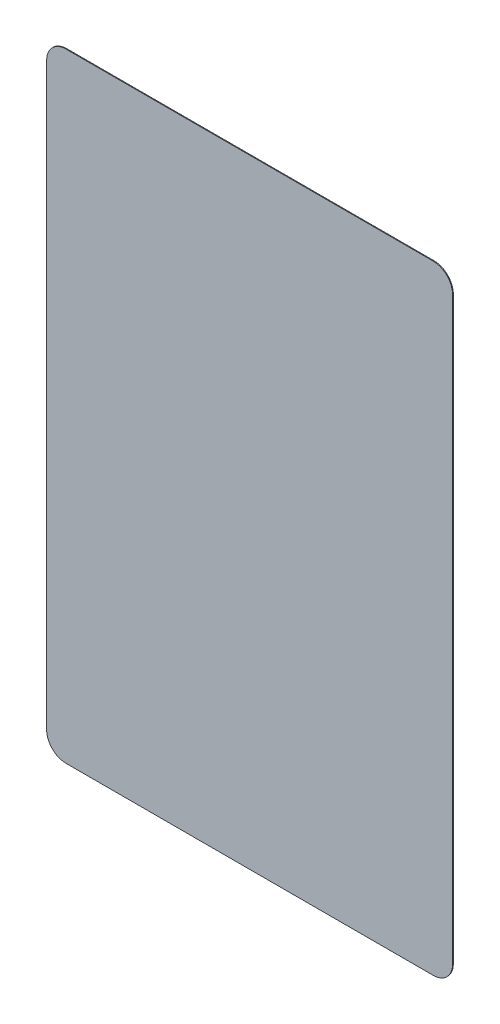
ISO-10303-21;
HEADER;
FILE_DESCRIPTION(('STEP AP214'),'2;1');
FILE_NAME('part.step','',(''),(''),'','','');
FILE_SCHEMA(('AUTOMOTIVE_DESIGN { 1 0 10303 214 1 1 1 1 }'));
ENDSEC;
DATA;
#1=APPLICATION_CONTEXT('core data for automotive mechanical design processes');
#2=APPLICATION_PROTOCOL_DEFINITION('international standard','automotive_design',2000,#1);
#3=PRODUCT_CONTEXT('',#1,'mechanical');
#4=PRODUCT('Part','Part','',(#3));
#5=PRODUCT_RELATED_PRODUCT_CATEGORY('part','',(#4));
#6=PRODUCT_DEFINITION_FORMATION('','',#4);
#7=PRODUCT_DEFINITION_CONTEXT('part definition',#1,'design');
#8=PRODUCT_DEFINITION('design','',#6,#7);
#9=PRODUCT_DEFINITION_SHAPE('','',#8);
#10=(LENGTH_UNIT() NAMED_UNIT(*) SI_UNIT(.MILLI.,.METRE.));
#11=(NAMED_UNIT(*) PLANE_ANGLE_UNIT() SI_UNIT($,.RADIAN.));
#12=(NAMED_UNIT(*) SI_UNIT($,.STERADIAN.) SOLID_ANGLE_UNIT());
#13=UNCERTAINTY_MEASURE_WITH_UNIT(LENGTH_MEASURE(1.E-05),#10,'distance_accuracy_value','');
#14=(GEOMETRIC_REPRESENTATION_CONTEXT(3) GLOBAL_UNCERTAINTY_ASSIGNED_CONTEXT((#13)) GLOBAL_UNIT_ASSIGNED_CONTEXT((#10,
#11,#12)) REPRESENTATION_CONTEXT('',''));
#15=CARTESIAN_POINT('',(0.,0.,0.));
#16=DIRECTION('',(0.,0.,1.));
#17=DIRECTION('',(1.,0.,0.));
#18=AXIS2_PLACEMENT_3D('',#15,#16,#17);
#19=CARTESIAN_POINT('',(25.,-7.5,-5.4));
#20=DIRECTION('',(0.,0.,1.));
#21=DIRECTION('',(1.,0.,0.));
#22=AXIS2_PLACEMENT_3D('',#19,#20,#21);
#23=PLANE('',#22);
#24=DIRECTION('',(-1.,0.,0.));
#25=VECTOR('',#24,1.);
#26=CARTESIAN_POINT('',(15.5,-8.,-5.4));
#27=LINE('',#26,#25);
#28=CARTESIAN_POINT('',(25.,-8.,-5.4));
#29=VERTEX_POINT('',#28);
#30=CARTESIAN_POINT('',(15.5,-8.,-5.4));
#31=VERTEX_POINT('',#30);
#32=EDGE_CURVE('E82',#29,#31,#27,.T.);
#33=ORIENTED_EDGE('',*,*,#32,.T.);
#34=CARTESIAN_POINT('',(15.5,-7.5,-5.4));
#35=DIRECTION('',(0.,0.,-1.));
#36=DIRECTION('',(-1.,0.,0.));
#37=AXIS2_PLACEMENT_3D('',#34,#35,#36);
#38=CIRCLE('',#37,0.500000000000002);
#39=CARTESIAN_POINT('',(15.,-7.5,-5.4));
#40=VERTEX_POINT('',#39);
#41=EDGE_CURVE('E105',#40,#31,#38,.F.);
#42=ORIENTED_EDGE('',*,*,#41,.F.);
#43=DIRECTION('',(0.,1.,0.));
#44=VECTOR('',#43,1.);
#45=CARTESIAN_POINT('',(15.,7.5,-5.4));
#46=LINE('',#45,#44);
#47=CARTESIAN_POINT('',(15.,7.5,-5.4));
#48=VERTEX_POINT('',#47);
#49=EDGE_CURVE('E102',#40,#48,#46,.T.);
#50=ORIENTED_EDGE('',*,*,#49,.T.);
#51=CARTESIAN_POINT('',(15.5,7.5,-5.4));
#52=DIRECTION('',(0.,0.,-1.));
#53=DIRECTION('',(-1.,0.,0.));
#54=AXIS2_PLACEMENT_3D('',#51,#52,#53);
#55=CIRCLE('',#54,0.5);
#56=CARTESIAN_POINT('',(15.5,8.,-5.4));
#57=VERTEX_POINT('',#56);
#58=EDGE_CURVE('E110',#57,#48,#55,.F.);
#59=ORIENTED_EDGE('',*,*,#58,.F.);
#60=DIRECTION('',(1.,0.,0.));
#61=VECTOR('',#60,1.);
#62=CARTESIAN_POINT('',(15.5,8.,-5.4));
#63=LINE('',#62,#61);
#64=CARTESIAN_POINT('',(25.,8.,-5.4));
#65=VERTEX_POINT('',#64);
#66=EDGE_CURVE('E107',#57,#65,#63,.T.);
#67=ORIENTED_EDGE('',*,*,#66,.T.);
#68=CARTESIAN_POINT('',(25.,7.5,-5.4));
#69=DIRECTION('',(0.,0.,-1.));
#70=DIRECTION('',(-1.,0.,0.));
#71=AXIS2_PLACEMENT_3D('',#68,#69,#70);
#72=CIRCLE('',#71,0.5);
#73=CARTESIAN_POINT('',(25.5,7.5,-5.4));
#74=VERTEX_POINT('',#73);
#75=EDGE_CURVE('E113',#74,#65,#72,.F.);
#76=ORIENTED_EDGE('',*,*,#75,.F.);
#77=DIRECTION('',(0.,-1.,0.));
#78=VECTOR('',#77,1.);
#79=CARTESIAN_POINT('',(25.5,7.5,-5.4));
#80=LINE('',#79,#78);
#81=CARTESIAN_POINT('',(25.5,-7.5,-5.4));
#82=VERTEX_POINT('',#81);
#83=EDGE_CURVE('E84',#74,#82,#80,.T.);
#84=ORIENTED_EDGE('',*,*,#83,.T.);
#85=CARTESIAN_POINT('',(25.,-7.5,-5.4));
#86=DIRECTION('',(0.,0.,-1.));
#87=DIRECTION('',(-1.,0.,0.));
#88=AXIS2_PLACEMENT_3D('',#85,#86,#87);
#89=CIRCLE('',#88,0.5);
#90=EDGE_CURVE('E20',#29,#82,#89,.F.);
#91=ORIENTED_EDGE('',*,*,#90,.F.);
#92=EDGE_LOOP('',(#33,#42,#50,#59,#67,#76,#84,#91));
#93=FACE_BOUND('',#92,.T.);
#94=ADVANCED_FACE('F17',(#93),#23,.F.);
#95=CARTESIAN_POINT('',(25.,-7.5,-5.38));
#96=DIRECTION('',(0.,0.,-1.));
#97=DIRECTION('',(-1.,0.,0.));
#98=AXIS2_PLACEMENT_3D('',#95,#96,#97);
#99=CYLINDRICAL_SURFACE('',#98,0.5);
#100=CARTESIAN_POINT('',(25.,-7.5,-5.38));
#101=DIRECTION('',(0.,0.,-1.));
#102=DIRECTION('',(-1.,0.,0.));
#103=AXIS2_PLACEMENT_3D('',#100,#101,#102);
#104=CIRCLE('',#103,0.5);
#105=CARTESIAN_POINT('',(25.,-8.,-5.38));
#106=VERTEX_POINT('',#105);
#107=CARTESIAN_POINT('',(25.5,-7.5,-5.38));
#108=VERTEX_POINT('',#107);
#109=EDGE_CURVE('E92',#106,#108,#104,.F.);
#110=ORIENTED_EDGE('',*,*,#109,.F.);
#111=DIRECTION('',(0.,0.,1.));
#112=VECTOR('',#111,1.);
#113=CARTESIAN_POINT('',(25.,-8.,-5.38));
#114=LINE('',#113,#112);
#115=EDGE_CURVE('E89',#106,#29,#114,.F.);
#116=ORIENTED_EDGE('',*,*,#115,.T.);
#117=ORIENTED_EDGE('',*,*,#90,.T.);
#118=DIRECTION('',(0.,0.,1.));
#119=VECTOR('',#118,1.);
#120=CARTESIAN_POINT('',(25.5,-7.5,-5.38));
#121=LINE('',#120,#119);
#122=EDGE_CURVE('E87',#82,#108,#121,.T.);
#123=ORIENTED_EDGE('',*,*,#122,.T.);
#124=EDGE_LOOP('',(#110,#116,#117,#123));
#125=FACE_BOUND('',#124,.T.);
#126=ADVANCED_FACE('F90',(#125),#99,.T.);
#127=CARTESIAN_POINT('',(25.5,7.5,-5.38));
#128=DIRECTION('',(-1.,0.,0.));
#129=DIRECTION('',(0.,-1.,0.));
#130=AXIS2_PLACEMENT_3D('',#127,#128,#129);
#131=PLANE('',#130);
#132=DIRECTION('',(0.,0.,-1.));
#133=VECTOR('',#132,1.);
#134=CARTESIAN_POINT('',(25.5,7.5,-5.38));
#135=LINE('',#134,#133);
#136=CARTESIAN_POINT('',(25.5,7.5,-5.38));
#137=VERTEX_POINT('',#136);
#138=EDGE_CURVE('E127',#137,#74,#135,.T.);
#139=ORIENTED_EDGE('',*,*,#138,.F.);
#140=DIRECTION('',(0.,1.,0.));
#141=VECTOR('',#140,1.);
#142=CARTESIAN_POINT('',(25.5,-7.5,-5.38));
#143=LINE('',#142,#141);
#144=EDGE_CURVE('E97',#108,#137,#143,.T.);
#145=ORIENTED_EDGE('',*,*,#144,.F.);
#146=ORIENTED_EDGE('',*,*,#122,.F.);
#147=ORIENTED_EDGE('',*,*,#83,.F.);
#148=EDGE_LOOP('',(#139,#145,#146,#147));
#149=FACE_BOUND('',#148,.T.);
#150=ADVANCED_FACE('F216',(#149),#131,.F.);
#151=CARTESIAN_POINT('',(25.,7.5,-5.38));
#152=DIRECTION('',(0.,0.,-1.));
#153=DIRECTION('',(-1.,0.,0.));
#154=AXIS2_PLACEMENT_3D('',#151,#152,#153);
#155=CYLINDRICAL_SURFACE('',#154,0.5);
#156=CARTESIAN_POINT('',(25.,7.5,-5.38));
#157=DIRECTION('',(0.,0.,-1.));
#158=DIRECTION('',(-1.,0.,0.));
#159=AXIS2_PLACEMENT_3D('',#156,#157,#158);
#160=CIRCLE('',#159,0.5);
#161=CARTESIAN_POINT('',(25.,8.,-5.38));
#162=VERTEX_POINT('',#161);
#163=EDGE_CURVE('E121',#137,#162,#160,.F.);
#164=ORIENTED_EDGE('',*,*,#163,.F.);
#165=ORIENTED_EDGE('',*,*,#138,.T.);
#166=ORIENTED_EDGE('',*,*,#75,.T.);
#167=DIRECTION('',(0.,0.,1.));
#168=VECTOR('',#167,1.);
#169=CARTESIAN_POINT('',(25.,8.,-5.38));
#170=LINE('',#169,#168);
#171=EDGE_CURVE('E111',#65,#162,#170,.T.);
#172=ORIENTED_EDGE('',*,*,#171,.T.);
#173=EDGE_LOOP('',(#164,#165,#166,#172));
#174=FACE_BOUND('',#173,.T.);
#175=ADVANCED_FACE('F206',(#174),#155,.T.);
#176=CARTESIAN_POINT('',(15.5,8.,-5.38));
#177=DIRECTION('',(0.,-1.,0.));
#178=DIRECTION('',(1.,0.,0.));
#179=AXIS2_PLACEMENT_3D('',#176,#177,#178);
#180=PLANE('',#179);
#181=DIRECTION('',(0.,0.,-1.));
#182=VECTOR('',#181,1.);
#183=CARTESIAN_POINT('',(15.5,8.,-5.38));
#184=LINE('',#183,#182);
#185=CARTESIAN_POINT('',(15.5,8.,-5.38));
#186=VERTEX_POINT('',#185);
#187=EDGE_CURVE('E126',#186,#57,#184,.T.);
#188=ORIENTED_EDGE('',*,*,#187,.F.);
#189=DIRECTION('',(1.,0.,0.));
#190=VECTOR('',#189,1.);
#191=CARTESIAN_POINT('',(25.,8.,-5.38));
#192=LINE('',#191,#190);
#193=EDGE_CURVE('E120',#162,#186,#192,.F.);
#194=ORIENTED_EDGE('',*,*,#193,.F.);
#195=ORIENTED_EDGE('',*,*,#171,.F.);
#196=ORIENTED_EDGE('',*,*,#66,.F.);
#197=EDGE_LOOP('',(#188,#194,#195,#196));
#198=FACE_BOUND('',#197,.T.);
#199=ADVANCED_FACE('F196',(#198),#180,.F.);
#200=CARTESIAN_POINT('',(15.5,7.5,-5.38));
#201=DIRECTION('',(0.,0.,-1.));
#202=DIRECTION('',(-1.,0.,0.));
#203=AXIS2_PLACEMENT_3D('',#200,#201,#202);
#204=CYLINDRICAL_SURFACE('',#203,0.5);
#205=CARTESIAN_POINT('',(15.5,7.5,-5.38));
#206=DIRECTION('',(0.,0.,-1.));
#207=DIRECTION('',(-1.,0.,0.));
#208=AXIS2_PLACEMENT_3D('',#205,#206,#207);
#209=CIRCLE('',#208,0.5);
#210=CARTESIAN_POINT('',(15.,7.5,-5.38));
#211=VERTEX_POINT('',#210);
#212=EDGE_CURVE('E117',#186,#211,#209,.F.);
#213=ORIENTED_EDGE('',*,*,#212,.F.);
#214=ORIENTED_EDGE('',*,*,#187,.T.);
#215=ORIENTED_EDGE('',*,*,#58,.T.);
#216=DIRECTION('',(0.,0.,1.));
#217=VECTOR('',#216,1.);
#218=CARTESIAN_POINT('',(15.,7.5,-5.38));
#219=LINE('',#218,#217);
#220=EDGE_CURVE('E106',#48,#211,#219,.T.);
#221=ORIENTED_EDGE('',*,*,#220,.T.);
#222=EDGE_LOOP('',(#213,#214,#215,#221));
#223=FACE_BOUND('',#222,.T.);
#224=ADVANCED_FACE('F161',(#223),#204,.T.);
#225=CARTESIAN_POINT('',(15.,7.5,-5.38));
#226=DIRECTION('',(1.,0.,0.));
#227=DIRECTION('',(0.,1.,0.));
#228=AXIS2_PLACEMENT_3D('',#225,#226,#227);
#229=PLANE('',#228);
#230=DIRECTION('',(0.,0.,-1.));
#231=VECTOR('',#230,1.);
#232=CARTESIAN_POINT('',(15.,-7.5,-5.38));
#233=LINE('',#232,#231);
#234=CARTESIAN_POINT('',(15.,-7.5,-5.38));
#235=VERTEX_POINT('',#234);
#236=EDGE_CURVE('E125',#235,#40,#233,.T.);
#237=ORIENTED_EDGE('',*,*,#236,.F.);
#238=DIRECTION('',(0.,1.,0.));
#239=VECTOR('',#238,1.);
#240=CARTESIAN_POINT('',(15.,-7.5,-5.38));
#241=LINE('',#240,#239);
#242=EDGE_CURVE('E116',#211,#235,#241,.F.);
#243=ORIENTED_EDGE('',*,*,#242,.F.);
#244=ORIENTED_EDGE('',*,*,#220,.F.);
#245=ORIENTED_EDGE('',*,*,#49,.F.);
#246=EDGE_LOOP('',(#237,#243,#244,#245));
#247=FACE_BOUND('',#246,.T.);
#248=ADVANCED_FACE('F150',(#247),#229,.F.);
#249=CARTESIAN_POINT('',(15.5,-7.5,-5.38));
#250=DIRECTION('',(0.,0.,-1.));
#251=DIRECTION('',(-1.,0.,0.));
#252=AXIS2_PLACEMENT_3D('',#249,#250,#251);
#253=CYLINDRICAL_SURFACE('',#252,0.500000000000002);
#254=CARTESIAN_POINT('',(15.5,-7.5,-5.38));
#255=DIRECTION('',(0.,0.,-1.));
#256=DIRECTION('',(-1.,0.,0.));
#257=AXIS2_PLACEMENT_3D('',#254,#255,#256);
#258=CIRCLE('',#257,0.500000000000002);
#259=CARTESIAN_POINT('',(15.5,-8.,-5.38));
#260=VERTEX_POINT('',#259);
#261=EDGE_CURVE('E26',#235,#260,#258,.F.);
#262=ORIENTED_EDGE('',*,*,#261,.F.);
#263=ORIENTED_EDGE('',*,*,#236,.T.);
#264=ORIENTED_EDGE('',*,*,#41,.T.);
#265=DIRECTION('',(0.,0.,1.));
#266=VECTOR('',#265,1.);
#267=CARTESIAN_POINT('',(15.5,-8.,-5.38));
#268=LINE('',#267,#266);
#269=EDGE_CURVE('E35',#31,#260,#268,.T.);
#270=ORIENTED_EDGE('',*,*,#269,.T.);
#271=EDGE_LOOP('',(#262,#263,#264,#270));
#272=FACE_BOUND('',#271,.T.);
#273=ADVANCED_FACE('F152',(#272),#253,.T.);
#274=CARTESIAN_POINT('',(15.5,-8.,-5.38));
#275=DIRECTION('',(0.,1.,0.));
#276=DIRECTION('',(-1.,0.,0.));
#277=AXIS2_PLACEMENT_3D('',#274,#275,#276);
#278=PLANE('',#277);
#279=ORIENTED_EDGE('',*,*,#115,.F.);
#280=DIRECTION('',(1.,0.,0.));
#281=VECTOR('',#280,1.);
#282=CARTESIAN_POINT('',(25.,-8.,-5.38));
#283=LINE('',#282,#281);
#284=EDGE_CURVE('E11',#260,#106,#283,.T.);
#285=ORIENTED_EDGE('',*,*,#284,.F.);
#286=ORIENTED_EDGE('',*,*,#269,.F.);
#287=ORIENTED_EDGE('',*,*,#32,.F.);
#288=EDGE_LOOP('',(#279,#285,#286,#287));
#289=FACE_BOUND('',#288,.T.);
#290=ADVANCED_FACE('F95',(#289),#278,.F.);
#291=CARTESIAN_POINT('',(25.,-7.5,-5.38));
#292=DIRECTION('',(0.,0.,1.));
#293=DIRECTION('',(1.,0.,0.));
#294=AXIS2_PLACEMENT_3D('',#291,#292,#293);
#295=PLANE('',#294);
#296=ORIENTED_EDGE('',*,*,#261,.T.);
#297=ORIENTED_EDGE('',*,*,#284,.T.);
#298=ORIENTED_EDGE('',*,*,#109,.T.);
#299=ORIENTED_EDGE('',*,*,#144,.T.);
#300=ORIENTED_EDGE('',*,*,#163,.T.);
#301=ORIENTED_EDGE('',*,*,#193,.T.);
#302=ORIENTED_EDGE('',*,*,#212,.T.);
#303=ORIENTED_EDGE('',*,*,#242,.T.);
#304=EDGE_LOOP('',(#296,#297,#298,#299,#300,#301,#302,#303));
#305=FACE_BOUND('',#304,.T.);
#306=ADVANCED_FACE('F146',(#305),#295,.T.);
#307=CLOSED_SHELL('',(#94,#126,#150,#175,#199,#224,#248,#273,#290,#306));
#308=MANIFOLD_SOLID_BREP('B1',#307);
#309=ADVANCED_BREP_SHAPE_REPRESENTATION('',(#18,#308),#14);
#310=SHAPE_DEFINITION_REPRESENTATION(#9,#309);
ENDSEC;
END-ISO-10303-21;
